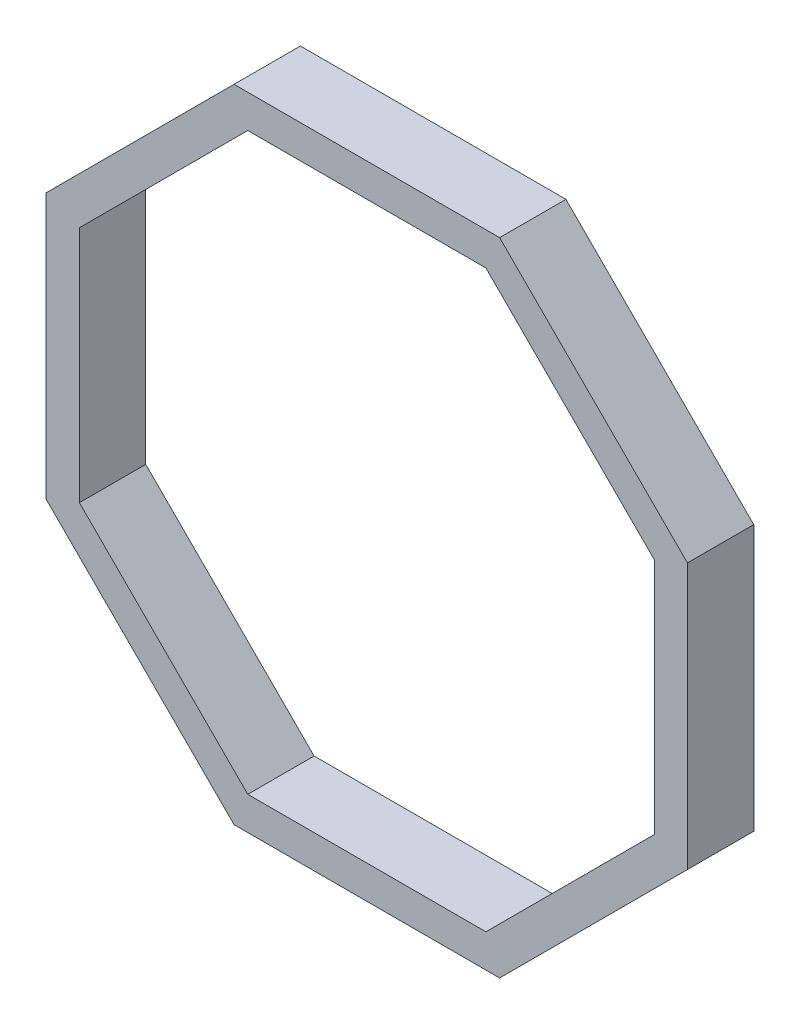
ISO-10303-21;
HEADER;
FILE_DESCRIPTION(('STEP AP214'),'2;1');
FILE_NAME('part.step','',(''),(''),'','','');
FILE_SCHEMA(('AUTOMOTIVE_DESIGN { 1 0 10303 214 1 1 1 1 }'));
ENDSEC;
DATA;
#1=APPLICATION_CONTEXT('core data for automotive mechanical design processes');
#2=APPLICATION_PROTOCOL_DEFINITION('international standard','automotive_design',2000,#1);
#3=PRODUCT_CONTEXT('',#1,'mechanical');
#4=PRODUCT('Part','Part','',(#3));
#5=PRODUCT_RELATED_PRODUCT_CATEGORY('part','',(#4));
#6=PRODUCT_DEFINITION_FORMATION('','',#4);
#7=PRODUCT_DEFINITION_CONTEXT('part definition',#1,'design');
#8=PRODUCT_DEFINITION('design','',#6,#7);
#9=PRODUCT_DEFINITION_SHAPE('','',#8);
#10=(LENGTH_UNIT() NAMED_UNIT(*) SI_UNIT(.MILLI.,.METRE.));
#11=(NAMED_UNIT(*) PLANE_ANGLE_UNIT() SI_UNIT($,.RADIAN.));
#12=(NAMED_UNIT(*) SI_UNIT($,.STERADIAN.) SOLID_ANGLE_UNIT());
#13=UNCERTAINTY_MEASURE_WITH_UNIT(LENGTH_MEASURE(1.E-05),#10,'distance_accuracy_value','');
#14=(GEOMETRIC_REPRESENTATION_CONTEXT(3) GLOBAL_UNCERTAINTY_ASSIGNED_CONTEXT((#13)) GLOBAL_UNIT_ASSIGNED_CONTEXT((#10,
#11,#12)) REPRESENTATION_CONTEXT('',''));
#15=CARTESIAN_POINT('',(0.,0.,0.));
#16=DIRECTION('',(0.,0.,1.));
#17=DIRECTION('',(1.,0.,0.));
#18=AXIS2_PLACEMENT_3D('',#15,#16,#17);
#19=CARTESIAN_POINT('',(0.,0.,30.));
#20=DIRECTION('',(0.,0.,1.));
#21=DIRECTION('',(1.,0.,0.));
#22=AXIS2_PLACEMENT_3D('',#19,#20,#21);
#23=PLANE('',#22);
#24=DIRECTION('',(0.,1.,0.));
#25=VECTOR('',#24,1.);
#26=CARTESIAN_POINT('',(145.,-60.0609665440986,30.));
#27=LINE('',#26,#25);
#28=CARTESIAN_POINT('',(145.,-60.0609665440986,30.));
#29=VERTEX_POINT('',#28);
#30=CARTESIAN_POINT('',(145.,60.0609665440987,30.));
#31=VERTEX_POINT('',#30);
#32=EDGE_CURVE('E211',#29,#31,#27,.T.);
#33=ORIENTED_EDGE('',*,*,#32,.T.);
#34=DIRECTION('',(-0.707106781186548,0.707106781186547,0.));
#35=VECTOR('',#34,1.);
#36=CARTESIAN_POINT('',(145.,60.0609665440987,30.));
#37=LINE('',#36,#35);
#38=CARTESIAN_POINT('',(60.0609665440985,145.,30.));
#39=VERTEX_POINT('',#38);
#40=EDGE_CURVE('E214',#31,#39,#37,.T.);
#41=ORIENTED_EDGE('',*,*,#40,.T.);
#42=DIRECTION('',(-1.,0.,0.));
#43=VECTOR('',#42,1.);
#44=CARTESIAN_POINT('',(60.0609665440985,145.,30.));
#45=LINE('',#44,#43);
#46=CARTESIAN_POINT('',(-60.0609665440988,145.,30.));
#47=VERTEX_POINT('',#46);
#48=EDGE_CURVE('E217',#39,#47,#45,.T.);
#49=ORIENTED_EDGE('',*,*,#48,.T.);
#50=DIRECTION('',(-0.707106781186547,-0.707106781186548,0.));
#51=VECTOR('',#50,1.);
#52=CARTESIAN_POINT('',(-60.0609665440988,145.,30.));
#53=LINE('',#52,#51);
#54=CARTESIAN_POINT('',(-145.,60.0609665440986,30.));
#55=VERTEX_POINT('',#54);
#56=EDGE_CURVE('E219',#47,#55,#53,.T.);
#57=ORIENTED_EDGE('',*,*,#56,.T.);
#58=DIRECTION('',(0.,-1.,0.));
#59=VECTOR('',#58,1.);
#60=CARTESIAN_POINT('',(-145.,60.0609665440986,30.));
#61=LINE('',#60,#59);
#62=CARTESIAN_POINT('',(-145.,-60.0609665440988,30.));
#63=VERTEX_POINT('',#62);
#64=EDGE_CURVE('E221',#55,#63,#61,.T.);
#65=ORIENTED_EDGE('',*,*,#64,.T.);
#66=DIRECTION('',(0.707106781186548,-0.707106781186547,0.));
#67=VECTOR('',#66,1.);
#68=CARTESIAN_POINT('',(-145.,-60.0609665440988,30.));
#69=LINE('',#68,#67);
#70=CARTESIAN_POINT('',(-60.0609665440986,-145.,30.));
#71=VERTEX_POINT('',#70);
#72=EDGE_CURVE('E223',#63,#71,#69,.T.);
#73=ORIENTED_EDGE('',*,*,#72,.T.);
#74=DIRECTION('',(1.,0.,0.));
#75=VECTOR('',#74,1.);
#76=CARTESIAN_POINT('',(-60.0609665440986,-145.,30.));
#77=LINE('',#76,#75);
#78=CARTESIAN_POINT('',(60.0609665440987,-145.,30.));
#79=VERTEX_POINT('',#78);
#80=EDGE_CURVE('E225',#71,#79,#77,.T.);
#81=ORIENTED_EDGE('',*,*,#80,.T.);
#82=DIRECTION('',(0.707106781186547,0.707106781186548,0.));
#83=VECTOR('',#82,1.);
#84=CARTESIAN_POINT('',(60.0609665440987,-145.,30.));
#85=LINE('',#84,#83);
#86=EDGE_CURVE('E227',#79,#29,#85,.T.);
#87=ORIENTED_EDGE('',*,*,#86,.T.);
#88=EDGE_LOOP('',(#33,#41,#49,#57,#65,#73,#81,#87));
#89=FACE_BOUND('',#88,.T.);
#90=DIRECTION('',(-0.707106781186548,0.707106781186547,0.));
#91=VECTOR('',#90,1.);
#92=CARTESIAN_POINT('',(130.,53.8477631085023,30.));
#93=LINE('',#92,#91);
#94=CARTESIAN_POINT('',(130.,53.8477631085023,30.));
#95=VERTEX_POINT('',#94);
#96=CARTESIAN_POINT('',(53.8477631085021,130.,30.));
#97=VERTEX_POINT('',#96);
#98=EDGE_CURVE('E154',#95,#97,#93,.T.);
#99=ORIENTED_EDGE('',*,*,#98,.F.);
#100=DIRECTION('',(0.,1.,0.));
#101=VECTOR('',#100,1.);
#102=CARTESIAN_POINT('',(130.,-53.8477631085022,30.));
#103=LINE('',#102,#101);
#104=CARTESIAN_POINT('',(130.,-53.8477631085022,30.));
#105=VERTEX_POINT('',#104);
#106=EDGE_CURVE('E146',#105,#95,#103,.T.);
#107=ORIENTED_EDGE('',*,*,#106,.F.);
#108=DIRECTION('',(0.707106781186548,0.707106781186548,0.));
#109=VECTOR('',#108,1.);
#110=CARTESIAN_POINT('',(53.8477631085023,-130.,30.));
#111=LINE('',#110,#109);
#112=CARTESIAN_POINT('',(53.8477631085023,-130.,30.));
#113=VERTEX_POINT('',#112);
#114=EDGE_CURVE('E179',#113,#105,#111,.T.);
#115=ORIENTED_EDGE('',*,*,#114,.F.);
#116=DIRECTION('',(1.,0.,0.));
#117=VECTOR('',#116,1.);
#118=CARTESIAN_POINT('',(-53.8477631085023,-130.,30.));
#119=LINE('',#118,#117);
#120=CARTESIAN_POINT('',(-53.8477631085023,-130.,30.));
#121=VERTEX_POINT('',#120);
#122=EDGE_CURVE('E177',#121,#113,#119,.T.);
#123=ORIENTED_EDGE('',*,*,#122,.F.);
#124=DIRECTION('',(0.707106781186548,-0.707106781186547,0.));
#125=VECTOR('',#124,1.);
#126=CARTESIAN_POINT('',(-130.,-53.8477631085024,30.));
#127=LINE('',#126,#125);
#128=CARTESIAN_POINT('',(-130.,-53.8477631085024,30.));
#129=VERTEX_POINT('',#128);
#130=EDGE_CURVE('E175',#129,#121,#127,.T.);
#131=ORIENTED_EDGE('',*,*,#130,.F.);
#132=DIRECTION('',(0.,-1.,0.));
#133=VECTOR('',#132,1.);
#134=CARTESIAN_POINT('',(-130.,53.8477631085022,30.));
#135=LINE('',#134,#133);
#136=CARTESIAN_POINT('',(-130.,53.8477631085022,30.));
#137=VERTEX_POINT('',#136);
#138=EDGE_CURVE('E173',#137,#129,#135,.T.);
#139=ORIENTED_EDGE('',*,*,#138,.F.);
#140=DIRECTION('',(-0.707106781186547,-0.707106781186548,0.));
#141=VECTOR('',#140,1.);
#142=CARTESIAN_POINT('',(-53.8477631085023,130.,30.));
#143=LINE('',#142,#141);
#144=CARTESIAN_POINT('',(-53.8477631085023,130.,30.));
#145=VERTEX_POINT('',#144);
#146=EDGE_CURVE('E169',#145,#137,#143,.T.);
#147=ORIENTED_EDGE('',*,*,#146,.F.);
#148=DIRECTION('',(-1.,0.,0.));
#149=VECTOR('',#148,1.);
#150=CARTESIAN_POINT('',(53.8477631085021,130.,30.));
#151=LINE('',#150,#149);
#152=EDGE_CURVE('E167',#97,#145,#151,.T.);
#153=ORIENTED_EDGE('',*,*,#152,.F.);
#154=EDGE_LOOP('',(#99,#107,#115,#123,#131,#139,#147,#153));
#155=FACE_BOUND('',#154,.T.);
#156=ADVANCED_FACE('F33',(#89,#155),#23,.T.);
#157=CARTESIAN_POINT('',(0.,0.,0.));
#158=DIRECTION('',(0.,0.,1.));
#159=DIRECTION('',(1.,0.,0.));
#160=AXIS2_PLACEMENT_3D('',#157,#158,#159);
#161=PLANE('',#160);
#162=DIRECTION('',(0.,1.,0.));
#163=VECTOR('',#162,1.);
#164=CARTESIAN_POINT('',(145.,-60.0609665440986,0.));
#165=LINE('',#164,#163);
#166=CARTESIAN_POINT('',(145.,-60.0609665440986,0.));
#167=VERTEX_POINT('',#166);
#168=CARTESIAN_POINT('',(145.,60.0609665440987,0.));
#169=VERTEX_POINT('',#168);
#170=EDGE_CURVE('E162',#167,#169,#165,.T.);
#171=ORIENTED_EDGE('',*,*,#170,.F.);
#172=DIRECTION('',(0.707106781186547,0.707106781186548,0.));
#173=VECTOR('',#172,1.);
#174=CARTESIAN_POINT('',(60.0609665440987,-145.,0.));
#175=LINE('',#174,#173);
#176=CARTESIAN_POINT('',(60.0609665440987,-145.,0.));
#177=VERTEX_POINT('',#176);
#178=EDGE_CURVE('E215',#177,#167,#175,.T.);
#179=ORIENTED_EDGE('',*,*,#178,.F.);
#180=DIRECTION('',(1.,0.,0.));
#181=VECTOR('',#180,1.);
#182=CARTESIAN_POINT('',(-60.0609665440986,-145.,0.));
#183=LINE('',#182,#181);
#184=CARTESIAN_POINT('',(-60.0609665440986,-145.,0.));
#185=VERTEX_POINT('',#184);
#186=EDGE_CURVE('E242',#185,#177,#183,.T.);
#187=ORIENTED_EDGE('',*,*,#186,.F.);
#188=DIRECTION('',(0.707106781186548,-0.707106781186547,0.));
#189=VECTOR('',#188,1.);
#190=CARTESIAN_POINT('',(-145.,-60.0609665440988,0.));
#191=LINE('',#190,#189);
#192=CARTESIAN_POINT('',(-145.,-60.0609665440988,0.));
#193=VERTEX_POINT('',#192);
#194=EDGE_CURVE('E240',#193,#185,#191,.T.);
#195=ORIENTED_EDGE('',*,*,#194,.F.);
#196=DIRECTION('',(0.,-1.,0.));
#197=VECTOR('',#196,1.);
#198=CARTESIAN_POINT('',(-145.,60.0609665440986,0.));
#199=LINE('',#198,#197);
#200=CARTESIAN_POINT('',(-145.,60.0609665440986,0.));
#201=VERTEX_POINT('',#200);
#202=EDGE_CURVE('E238',#201,#193,#199,.T.);
#203=ORIENTED_EDGE('',*,*,#202,.F.);
#204=DIRECTION('',(-0.707106781186547,-0.707106781186548,0.));
#205=VECTOR('',#204,1.);
#206=CARTESIAN_POINT('',(-60.0609665440988,145.,0.));
#207=LINE('',#206,#205);
#208=CARTESIAN_POINT('',(-60.0609665440988,145.,0.));
#209=VERTEX_POINT('',#208);
#210=EDGE_CURVE('E236',#209,#201,#207,.T.);
#211=ORIENTED_EDGE('',*,*,#210,.F.);
#212=DIRECTION('',(-1.,0.,0.));
#213=VECTOR('',#212,1.);
#214=CARTESIAN_POINT('',(60.0609665440985,145.,0.));
#215=LINE('',#214,#213);
#216=CARTESIAN_POINT('',(60.0609665440985,145.,0.));
#217=VERTEX_POINT('',#216);
#218=EDGE_CURVE('E234',#217,#209,#215,.T.);
#219=ORIENTED_EDGE('',*,*,#218,.F.);
#220=DIRECTION('',(-0.707106781186548,0.707106781186547,0.));
#221=VECTOR('',#220,1.);
#222=CARTESIAN_POINT('',(145.,60.0609665440987,0.));
#223=LINE('',#222,#221);
#224=EDGE_CURVE('E232',#169,#217,#223,.T.);
#225=ORIENTED_EDGE('',*,*,#224,.F.);
#226=EDGE_LOOP('',(#171,#179,#187,#195,#203,#211,#219,#225));
#227=FACE_BOUND('',#226,.T.);
#228=DIRECTION('',(0.,1.,0.));
#229=VECTOR('',#228,1.);
#230=CARTESIAN_POINT('',(130.,-53.8477631085022,0.));
#231=LINE('',#230,#229);
#232=CARTESIAN_POINT('',(130.,-53.8477631085022,0.));
#233=VERTEX_POINT('',#232);
#234=CARTESIAN_POINT('',(130.,53.8477631085023,0.));
#235=VERTEX_POINT('',#234);
#236=EDGE_CURVE('E56',#233,#235,#231,.T.);
#237=ORIENTED_EDGE('',*,*,#236,.T.);
#238=DIRECTION('',(-0.707106781186548,0.707106781186547,0.));
#239=VECTOR('',#238,1.);
#240=CARTESIAN_POINT('',(130.,53.8477631085023,0.));
#241=LINE('',#240,#239);
#242=CARTESIAN_POINT('',(53.8477631085021,130.,0.));
#243=VERTEX_POINT('',#242);
#244=EDGE_CURVE('E161',#235,#243,#241,.T.);
#245=ORIENTED_EDGE('',*,*,#244,.T.);
#246=DIRECTION('',(-1.,0.,0.));
#247=VECTOR('',#246,1.);
#248=CARTESIAN_POINT('',(53.8477631085021,130.,0.));
#249=LINE('',#248,#247);
#250=CARTESIAN_POINT('',(-53.8477631085023,130.,0.));
#251=VERTEX_POINT('',#250);
#252=EDGE_CURVE('E183',#243,#251,#249,.T.);
#253=ORIENTED_EDGE('',*,*,#252,.T.);
#254=DIRECTION('',(-0.707106781186547,-0.707106781186548,0.));
#255=VECTOR('',#254,1.);
#256=CARTESIAN_POINT('',(-53.8477631085023,130.,0.));
#257=LINE('',#256,#255);
#258=CARTESIAN_POINT('',(-130.,53.8477631085022,0.));
#259=VERTEX_POINT('',#258);
#260=EDGE_CURVE('E186',#251,#259,#257,.T.);
#261=ORIENTED_EDGE('',*,*,#260,.T.);
#262=DIRECTION('',(0.,-1.,0.));
#263=VECTOR('',#262,1.);
#264=CARTESIAN_POINT('',(-130.,53.8477631085022,0.));
#265=LINE('',#264,#263);
#266=CARTESIAN_POINT('',(-130.,-53.8477631085024,0.));
#267=VERTEX_POINT('',#266);
#268=EDGE_CURVE('E189',#259,#267,#265,.T.);
#269=ORIENTED_EDGE('',*,*,#268,.T.);
#270=DIRECTION('',(0.707106781186548,-0.707106781186547,0.));
#271=VECTOR('',#270,1.);
#272=CARTESIAN_POINT('',(-130.,-53.8477631085024,0.));
#273=LINE('',#272,#271);
#274=CARTESIAN_POINT('',(-53.8477631085023,-130.,0.));
#275=VERTEX_POINT('',#274);
#276=EDGE_CURVE('E192',#267,#275,#273,.T.);
#277=ORIENTED_EDGE('',*,*,#276,.T.);
#278=DIRECTION('',(1.,0.,0.));
#279=VECTOR('',#278,1.);
#280=CARTESIAN_POINT('',(-53.8477631085023,-130.,0.));
#281=LINE('',#280,#279);
#282=CARTESIAN_POINT('',(53.8477631085023,-130.,0.));
#283=VERTEX_POINT('',#282);
#284=EDGE_CURVE('E195',#275,#283,#281,.T.);
#285=ORIENTED_EDGE('',*,*,#284,.T.);
#286=DIRECTION('',(0.707106781186548,0.707106781186548,0.));
#287=VECTOR('',#286,1.);
#288=CARTESIAN_POINT('',(53.8477631085023,-130.,0.));
#289=LINE('',#288,#287);
#290=EDGE_CURVE('E155',#283,#233,#289,.T.);
#291=ORIENTED_EDGE('',*,*,#290,.T.);
#292=EDGE_LOOP('',(#237,#245,#253,#261,#269,#277,#285,#291));
#293=FACE_BOUND('',#292,.T.);
#294=ADVANCED_FACE('F272',(#227,#293),#161,.F.);
#295=CARTESIAN_POINT('',(145.,-60.0609665440986,30.));
#296=DIRECTION('',(-1.,0.,0.));
#297=DIRECTION('',(0.,-1.,0.));
#298=AXIS2_PLACEMENT_3D('',#295,#296,#297);
#299=PLANE('',#298);
#300=ORIENTED_EDGE('',*,*,#170,.T.);
#301=DIRECTION('',(0.,0.,-1.));
#302=VECTOR('',#301,1.);
#303=CARTESIAN_POINT('',(145.,60.0609665440987,30.));
#304=LINE('',#303,#302);
#305=EDGE_CURVE('E11',#31,#169,#304,.T.);
#306=ORIENTED_EDGE('',*,*,#305,.F.);
#307=ORIENTED_EDGE('',*,*,#32,.F.);
#308=DIRECTION('',(0.,0.,-1.));
#309=VECTOR('',#308,1.);
#310=CARTESIAN_POINT('',(145.,-60.0609665440986,30.));
#311=LINE('',#310,#309);
#312=EDGE_CURVE('E229',#29,#167,#311,.T.);
#313=ORIENTED_EDGE('',*,*,#312,.T.);
#314=EDGE_LOOP('',(#300,#306,#307,#313));
#315=FACE_BOUND('',#314,.T.);
#316=ADVANCED_FACE('F35',(#315),#299,.F.);
#317=CARTESIAN_POINT('',(145.,60.0609665440987,30.));
#318=DIRECTION('',(-0.707106781186547,-0.707106781186548,0.));
#319=DIRECTION('',(0.707106781186548,-0.707106781186547,0.));
#320=AXIS2_PLACEMENT_3D('',#317,#318,#319);
#321=PLANE('',#320);
#322=ORIENTED_EDGE('',*,*,#224,.T.);
#323=DIRECTION('',(0.,0.,-1.));
#324=VECTOR('',#323,1.);
#325=CARTESIAN_POINT('',(60.0609665440985,145.,30.));
#326=LINE('',#325,#324);
#327=EDGE_CURVE('E41',#39,#217,#326,.T.);
#328=ORIENTED_EDGE('',*,*,#327,.F.);
#329=ORIENTED_EDGE('',*,*,#40,.F.);
#330=ORIENTED_EDGE('',*,*,#305,.T.);
#331=EDGE_LOOP('',(#322,#328,#329,#330));
#332=FACE_BOUND('',#331,.T.);
#333=ADVANCED_FACE('F289',(#332),#321,.F.);
#334=CARTESIAN_POINT('',(60.0609665440985,145.,30.));
#335=DIRECTION('',(0.,-1.,0.));
#336=DIRECTION('',(1.,0.,0.));
#337=AXIS2_PLACEMENT_3D('',#334,#335,#336);
#338=PLANE('',#337);
#339=ORIENTED_EDGE('',*,*,#218,.T.);
#340=DIRECTION('',(0.,0.,-1.));
#341=VECTOR('',#340,1.);
#342=CARTESIAN_POINT('',(-60.0609665440988,145.,30.));
#343=LINE('',#342,#341);
#344=EDGE_CURVE('E259',#47,#209,#343,.T.);
#345=ORIENTED_EDGE('',*,*,#344,.F.);
#346=ORIENTED_EDGE('',*,*,#48,.F.);
#347=ORIENTED_EDGE('',*,*,#327,.T.);
#348=EDGE_LOOP('',(#339,#345,#346,#347));
#349=FACE_BOUND('',#348,.T.);
#350=ADVANCED_FACE('F266',(#349),#338,.F.);
#351=CARTESIAN_POINT('',(-60.0609665440988,145.,30.));
#352=DIRECTION('',(0.707106781186548,-0.707106781186547,0.));
#353=DIRECTION('',(0.707106781186547,0.707106781186548,0.));
#354=AXIS2_PLACEMENT_3D('',#351,#352,#353);
#355=PLANE('',#354);
#356=ORIENTED_EDGE('',*,*,#210,.T.);
#357=DIRECTION('',(0.,0.,-1.));
#358=VECTOR('',#357,1.);
#359=CARTESIAN_POINT('',(-145.,60.0609665440986,30.));
#360=LINE('',#359,#358);
#361=EDGE_CURVE('E256',#55,#201,#360,.T.);
#362=ORIENTED_EDGE('',*,*,#361,.F.);
#363=ORIENTED_EDGE('',*,*,#56,.F.);
#364=ORIENTED_EDGE('',*,*,#344,.T.);
#365=EDGE_LOOP('',(#356,#362,#363,#364));
#366=FACE_BOUND('',#365,.T.);
#367=ADVANCED_FACE('F278',(#366),#355,.F.);
#368=CARTESIAN_POINT('',(-145.,60.0609665440986,30.));
#369=DIRECTION('',(1.,0.,0.));
#370=DIRECTION('',(0.,1.,0.));
#371=AXIS2_PLACEMENT_3D('',#368,#369,#370);
#372=PLANE('',#371);
#373=ORIENTED_EDGE('',*,*,#202,.T.);
#374=DIRECTION('',(0.,0.,-1.));
#375=VECTOR('',#374,1.);
#376=CARTESIAN_POINT('',(-145.,-60.0609665440988,30.));
#377=LINE('',#376,#375);
#378=EDGE_CURVE('E253',#63,#193,#377,.T.);
#379=ORIENTED_EDGE('',*,*,#378,.F.);
#380=ORIENTED_EDGE('',*,*,#64,.F.);
#381=ORIENTED_EDGE('',*,*,#361,.T.);
#382=EDGE_LOOP('',(#373,#379,#380,#381));
#383=FACE_BOUND('',#382,.T.);
#384=ADVANCED_FACE('F282',(#383),#372,.F.);
#385=CARTESIAN_POINT('',(-145.,-60.0609665440988,30.));
#386=DIRECTION('',(0.707106781186547,0.707106781186548,0.));
#387=DIRECTION('',(-0.707106781186548,0.707106781186547,0.));
#388=AXIS2_PLACEMENT_3D('',#385,#386,#387);
#389=PLANE('',#388);
#390=ORIENTED_EDGE('',*,*,#194,.T.);
#391=DIRECTION('',(0.,0.,-1.));
#392=VECTOR('',#391,1.);
#393=CARTESIAN_POINT('',(-60.0609665440986,-145.,30.));
#394=LINE('',#393,#392);
#395=EDGE_CURVE('E250',#71,#185,#394,.T.);
#396=ORIENTED_EDGE('',*,*,#395,.F.);
#397=ORIENTED_EDGE('',*,*,#72,.F.);
#398=ORIENTED_EDGE('',*,*,#378,.T.);
#399=EDGE_LOOP('',(#390,#396,#397,#398));
#400=FACE_BOUND('',#399,.T.);
#401=ADVANCED_FACE('F302',(#400),#389,.F.);
#402=CARTESIAN_POINT('',(-60.0609665440986,-145.,30.));
#403=DIRECTION('',(0.,1.,0.));
#404=DIRECTION('',(-1.,0.,0.));
#405=AXIS2_PLACEMENT_3D('',#402,#403,#404);
#406=PLANE('',#405);
#407=ORIENTED_EDGE('',*,*,#186,.T.);
#408=DIRECTION('',(0.,0.,-1.));
#409=VECTOR('',#408,1.);
#410=CARTESIAN_POINT('',(60.0609665440987,-145.,30.));
#411=LINE('',#410,#409);
#412=EDGE_CURVE('E247',#79,#177,#411,.T.);
#413=ORIENTED_EDGE('',*,*,#412,.F.);
#414=ORIENTED_EDGE('',*,*,#80,.F.);
#415=ORIENTED_EDGE('',*,*,#395,.T.);
#416=EDGE_LOOP('',(#407,#413,#414,#415));
#417=FACE_BOUND('',#416,.T.);
#418=ADVANCED_FACE('F300',(#417),#406,.F.);
#419=CARTESIAN_POINT('',(60.0609665440987,-145.,30.));
#420=DIRECTION('',(-0.707106781186548,0.707106781186547,0.));
#421=DIRECTION('',(-0.707106781186547,-0.707106781186548,0.));
#422=AXIS2_PLACEMENT_3D('',#419,#420,#421);
#423=PLANE('',#422);
#424=ORIENTED_EDGE('',*,*,#178,.T.);
#425=ORIENTED_EDGE('',*,*,#312,.F.);
#426=ORIENTED_EDGE('',*,*,#86,.F.);
#427=ORIENTED_EDGE('',*,*,#412,.T.);
#428=EDGE_LOOP('',(#424,#425,#426,#427));
#429=FACE_BOUND('',#428,.T.);
#430=ADVANCED_FACE('F295',(#429),#423,.F.);
#431=CARTESIAN_POINT('',(130.,-53.8477631085022,30.));
#432=DIRECTION('',(-1.,0.,0.));
#433=DIRECTION('',(0.,-1.,0.));
#434=AXIS2_PLACEMENT_3D('',#431,#432,#433);
#435=PLANE('',#434);
#436=ORIENTED_EDGE('',*,*,#236,.F.);
#437=DIRECTION('',(0.,0.,-1.));
#438=VECTOR('',#437,1.);
#439=CARTESIAN_POINT('',(130.,-53.8477631085022,30.));
#440=LINE('',#439,#438);
#441=EDGE_CURVE('E150',#105,#233,#440,.T.);
#442=ORIENTED_EDGE('',*,*,#441,.F.);
#443=ORIENTED_EDGE('',*,*,#106,.T.);
#444=DIRECTION('',(0.,0.,-1.));
#445=VECTOR('',#444,1.);
#446=CARTESIAN_POINT('',(130.,53.8477631085023,30.));
#447=LINE('',#446,#445);
#448=EDGE_CURVE('E149',#95,#235,#447,.T.);
#449=ORIENTED_EDGE('',*,*,#448,.T.);
#450=EDGE_LOOP('',(#436,#442,#443,#449));
#451=FACE_BOUND('',#450,.T.);
#452=ADVANCED_FACE('F148',(#451),#435,.T.);
#453=CARTESIAN_POINT('',(130.,53.8477631085023,30.));
#454=DIRECTION('',(-0.707106781186547,-0.707106781186548,0.));
#455=DIRECTION('',(0.707106781186548,-0.707106781186547,0.));
#456=AXIS2_PLACEMENT_3D('',#453,#454,#455);
#457=PLANE('',#456);
#458=ORIENTED_EDGE('',*,*,#244,.F.);
#459=ORIENTED_EDGE('',*,*,#448,.F.);
#460=ORIENTED_EDGE('',*,*,#98,.T.);
#461=DIRECTION('',(0.,0.,-1.));
#462=VECTOR('',#461,1.);
#463=CARTESIAN_POINT('',(53.8477631085021,130.,30.));
#464=LINE('',#463,#462);
#465=EDGE_CURVE('E163',#97,#243,#464,.T.);
#466=ORIENTED_EDGE('',*,*,#465,.T.);
#467=EDGE_LOOP('',(#458,#459,#460,#466));
#468=FACE_BOUND('',#467,.T.);
#469=ADVANCED_FACE('F158',(#468),#457,.T.);
#470=CARTESIAN_POINT('',(53.8477631085021,130.,30.));
#471=DIRECTION('',(0.,-1.,0.));
#472=DIRECTION('',(1.,0.,0.));
#473=AXIS2_PLACEMENT_3D('',#470,#471,#472);
#474=PLANE('',#473);
#475=ORIENTED_EDGE('',*,*,#252,.F.);
#476=ORIENTED_EDGE('',*,*,#465,.F.);
#477=ORIENTED_EDGE('',*,*,#152,.T.);
#478=DIRECTION('',(0.,0.,-1.));
#479=VECTOR('',#478,1.);
#480=CARTESIAN_POINT('',(-53.8477631085023,130.,30.));
#481=LINE('',#480,#479);
#482=EDGE_CURVE('E208',#145,#251,#481,.T.);
#483=ORIENTED_EDGE('',*,*,#482,.T.);
#484=EDGE_LOOP('',(#475,#476,#477,#483));
#485=FACE_BOUND('',#484,.T.);
#486=ADVANCED_FACE('F327',(#485),#474,.T.);
#487=CARTESIAN_POINT('',(-53.8477631085023,130.,30.));
#488=DIRECTION('',(0.707106781186548,-0.707106781186547,0.));
#489=DIRECTION('',(0.707106781186547,0.707106781186548,0.));
#490=AXIS2_PLACEMENT_3D('',#487,#488,#489);
#491=PLANE('',#490);
#492=ORIENTED_EDGE('',*,*,#260,.F.);
#493=ORIENTED_EDGE('',*,*,#482,.F.);
#494=ORIENTED_EDGE('',*,*,#146,.T.);
#495=DIRECTION('',(0.,0.,-1.));
#496=VECTOR('',#495,1.);
#497=CARTESIAN_POINT('',(-130.,53.8477631085022,30.));
#498=LINE('',#497,#496);
#499=EDGE_CURVE('E206',#137,#259,#498,.T.);
#500=ORIENTED_EDGE('',*,*,#499,.T.);
#501=EDGE_LOOP('',(#492,#493,#494,#500));
#502=FACE_BOUND('',#501,.T.);
#503=ADVANCED_FACE('F331',(#502),#491,.T.);
#504=CARTESIAN_POINT('',(-130.,53.8477631085022,30.));
#505=DIRECTION('',(1.,0.,0.));
#506=DIRECTION('',(0.,1.,0.));
#507=AXIS2_PLACEMENT_3D('',#504,#505,#506);
#508=PLANE('',#507);
#509=ORIENTED_EDGE('',*,*,#268,.F.);
#510=ORIENTED_EDGE('',*,*,#499,.F.);
#511=ORIENTED_EDGE('',*,*,#138,.T.);
#512=DIRECTION('',(0.,0.,-1.));
#513=VECTOR('',#512,1.);
#514=CARTESIAN_POINT('',(-130.,-53.8477631085024,30.));
#515=LINE('',#514,#513);
#516=EDGE_CURVE('E204',#129,#267,#515,.T.);
#517=ORIENTED_EDGE('',*,*,#516,.T.);
#518=EDGE_LOOP('',(#509,#510,#511,#517));
#519=FACE_BOUND('',#518,.T.);
#520=ADVANCED_FACE('F337',(#519),#508,.T.);
#521=CARTESIAN_POINT('',(-130.,-53.8477631085024,30.));
#522=DIRECTION('',(0.707106781186547,0.707106781186548,0.));
#523=DIRECTION('',(-0.707106781186548,0.707106781186547,0.));
#524=AXIS2_PLACEMENT_3D('',#521,#522,#523);
#525=PLANE('',#524);
#526=ORIENTED_EDGE('',*,*,#276,.F.);
#527=ORIENTED_EDGE('',*,*,#516,.F.);
#528=ORIENTED_EDGE('',*,*,#130,.T.);
#529=DIRECTION('',(0.,0.,-1.));
#530=VECTOR('',#529,1.);
#531=CARTESIAN_POINT('',(-53.8477631085023,-130.,30.));
#532=LINE('',#531,#530);
#533=EDGE_CURVE('E202',#121,#275,#532,.T.);
#534=ORIENTED_EDGE('',*,*,#533,.T.);
#535=EDGE_LOOP('',(#526,#527,#528,#534));
#536=FACE_BOUND('',#535,.T.);
#537=ADVANCED_FACE('F341',(#536),#525,.T.);
#538=CARTESIAN_POINT('',(-53.8477631085023,-130.,30.));
#539=DIRECTION('',(0.,1.,0.));
#540=DIRECTION('',(-1.,0.,0.));
#541=AXIS2_PLACEMENT_3D('',#538,#539,#540);
#542=PLANE('',#541);
#543=ORIENTED_EDGE('',*,*,#284,.F.);
#544=ORIENTED_EDGE('',*,*,#533,.F.);
#545=ORIENTED_EDGE('',*,*,#122,.T.);
#546=DIRECTION('',(0.,0.,-1.));
#547=VECTOR('',#546,1.);
#548=CARTESIAN_POINT('',(53.8477631085023,-130.,30.));
#549=LINE('',#548,#547);
#550=EDGE_CURVE('E48',#113,#283,#549,.T.);
#551=ORIENTED_EDGE('',*,*,#550,.T.);
#552=EDGE_LOOP('',(#543,#544,#545,#551));
#553=FACE_BOUND('',#552,.T.);
#554=ADVANCED_FACE('F345',(#553),#542,.T.);
#555=CARTESIAN_POINT('',(53.8477631085023,-130.,30.));
#556=DIRECTION('',(-0.707106781186547,0.707106781186547,0.));
#557=DIRECTION('',(-0.707106781186548,-0.707106781186548,0.));
#558=AXIS2_PLACEMENT_3D('',#555,#556,#557);
#559=PLANE('',#558);
#560=ORIENTED_EDGE('',*,*,#290,.F.);
#561=ORIENTED_EDGE('',*,*,#550,.F.);
#562=ORIENTED_EDGE('',*,*,#114,.T.);
#563=ORIENTED_EDGE('',*,*,#441,.T.);
#564=EDGE_LOOP('',(#560,#561,#562,#563));
#565=FACE_BOUND('',#564,.T.);
#566=ADVANCED_FACE('F349',(#565),#559,.T.);
#567=CLOSED_SHELL('',(#156,#294,#316,#333,#350,#367,#384,#401,#418,#430,#452,#469,#486,#503,
#520,#537,#554,#566));
#568=MANIFOLD_SOLID_BREP('B2',#567);
#569=ADVANCED_BREP_SHAPE_REPRESENTATION('',(#18,#568),#14);
#570=SHAPE_DEFINITION_REPRESENTATION(#9,#569);
ENDSEC;
END-ISO-10303-21;
